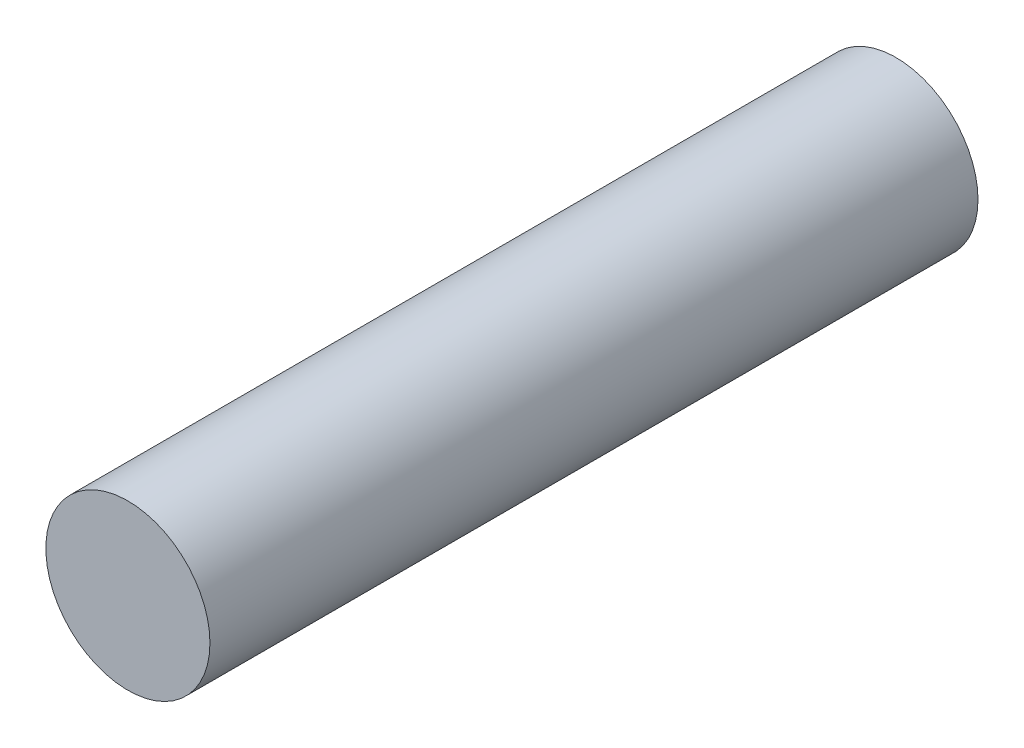
ISO-10303-21;
HEADER;
FILE_DESCRIPTION(('STEP AP214'),'2;1');
FILE_NAME('part.step','',(''),(''),'','','');
FILE_SCHEMA(('AUTOMOTIVE_DESIGN { 1 0 10303 214 1 1 1 1 }'));
ENDSEC;
DATA;
#1=APPLICATION_CONTEXT('core data for automotive mechanical design processes');
#2=APPLICATION_PROTOCOL_DEFINITION('international standard','automotive_design',2000,#1);
#3=PRODUCT_CONTEXT('',#1,'mechanical');
#4=PRODUCT('Part','Part','',(#3));
#5=PRODUCT_RELATED_PRODUCT_CATEGORY('part','',(#4));
#6=PRODUCT_DEFINITION_FORMATION('','',#4);
#7=PRODUCT_DEFINITION_CONTEXT('part definition',#1,'design');
#8=PRODUCT_DEFINITION('design','',#6,#7);
#9=PRODUCT_DEFINITION_SHAPE('','',#8);
#10=(LENGTH_UNIT() NAMED_UNIT(*) SI_UNIT(.MILLI.,.METRE.));
#11=(NAMED_UNIT(*) PLANE_ANGLE_UNIT() SI_UNIT($,.RADIAN.));
#12=(NAMED_UNIT(*) SI_UNIT($,.STERADIAN.) SOLID_ANGLE_UNIT());
#13=UNCERTAINTY_MEASURE_WITH_UNIT(LENGTH_MEASURE(1.E-05),#10,'distance_accuracy_value','');
#14=(GEOMETRIC_REPRESENTATION_CONTEXT(3) GLOBAL_UNCERTAINTY_ASSIGNED_CONTEXT((#13)) GLOBAL_UNIT_ASSIGNED_CONTEXT((#10,
#11,#12)) REPRESENTATION_CONTEXT('',''));
#15=CARTESIAN_POINT('',(0.,0.,0.));
#16=DIRECTION('',(0.,0.,1.));
#17=DIRECTION('',(1.,0.,0.));
#18=AXIS2_PLACEMENT_3D('',#15,#16,#17);
#19=CARTESIAN_POINT('',(0.,0.,23.4));
#20=DIRECTION('',(0.,0.,-1.));
#21=DIRECTION('',(-1.,0.,0.));
#22=AXIS2_PLACEMENT_3D('',#19,#20,#21);
#23=CYLINDRICAL_SURFACE('',#22,2.5);
#24=CARTESIAN_POINT('',(0.,0.,23.4));
#25=DIRECTION('',(0.,0.,1.));
#26=DIRECTION('',(1.,0.,0.));
#27=AXIS2_PLACEMENT_3D('',#24,#25,#26);
#28=CIRCLE('',#27,2.5);
#29=CARTESIAN_POINT('',(2.5,0.,23.4));
#30=VERTEX_POINT('',#29);
#31=EDGE_CURVE('E10',#30,#30,#28,.T.);
#32=ORIENTED_EDGE('',*,*,#31,.F.);
#33=EDGE_LOOP('',(#32));
#34=FACE_BOUND('',#33,.T.);
#35=CARTESIAN_POINT('',(0.,0.,0.));
#36=DIRECTION('',(0.,0.,1.));
#37=DIRECTION('',(1.,0.,0.));
#38=AXIS2_PLACEMENT_3D('',#35,#36,#37);
#39=CIRCLE('',#38,2.5);
#40=CARTESIAN_POINT('',(2.5,0.,0.));
#41=VERTEX_POINT('',#40);
#42=EDGE_CURVE('E42',#41,#41,#39,.T.);
#43=ORIENTED_EDGE('',*,*,#42,.T.);
#44=EDGE_LOOP('',(#43));
#45=FACE_BOUND('',#44,.T.);
#46=ADVANCED_FACE('F39',(#34,#45),#23,.T.);
#47=CARTESIAN_POINT('',(0.,0.,23.4));
#48=DIRECTION('',(0.,0.,1.));
#49=DIRECTION('',(1.,0.,0.));
#50=AXIS2_PLACEMENT_3D('',#47,#48,#49);
#51=PLANE('',#50);
#52=ORIENTED_EDGE('',*,*,#31,.T.);
#53=EDGE_LOOP('',(#52));
#54=FACE_BOUND('',#53,.T.);
#55=ADVANCED_FACE('F54',(#54),#51,.T.);
#56=CARTESIAN_POINT('',(0.,0.,0.));
#57=DIRECTION('',(0.,0.,1.));
#58=DIRECTION('',(1.,0.,0.));
#59=AXIS2_PLACEMENT_3D('',#56,#57,#58);
#60=PLANE('',#59);
#61=ORIENTED_EDGE('',*,*,#42,.F.);
#62=EDGE_LOOP('',(#61));
#63=FACE_BOUND('',#62,.T.);
#64=ADVANCED_FACE('F52',(#63),#60,.F.);
#65=CLOSED_SHELL('',(#46,#55,#64));
#66=MANIFOLD_SOLID_BREP('B2',#65);
#67=ADVANCED_BREP_SHAPE_REPRESENTATION('',(#18,#66),#14);
#68=SHAPE_DEFINITION_REPRESENTATION(#9,#67);
ENDSEC;
END-ISO-10303-21;
